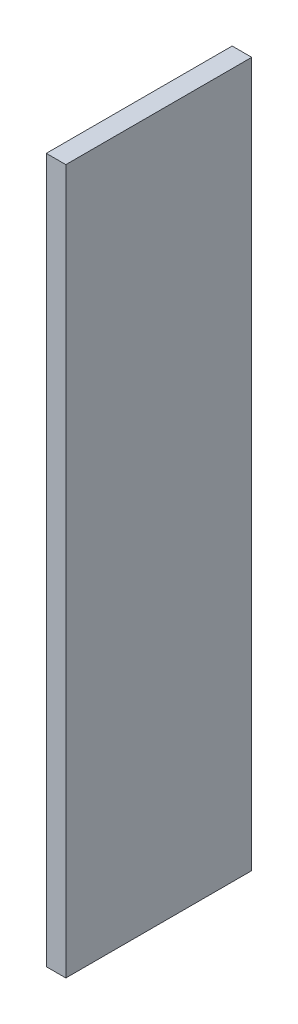
ISO-10303-21;
HEADER;
FILE_DESCRIPTION(('STEP AP214'),'2;1');
FILE_NAME('part.step','',(''),(''),'','','');
FILE_SCHEMA(('AUTOMOTIVE_DESIGN { 1 0 10303 214 1 1 1 1 }'));
ENDSEC;
DATA;
#1=APPLICATION_CONTEXT('core data for automotive mechanical design processes');
#2=APPLICATION_PROTOCOL_DEFINITION('international standard','automotive_design',2000,#1);
#3=PRODUCT_CONTEXT('',#1,'mechanical');
#4=PRODUCT('Part','Part','',(#3));
#5=PRODUCT_RELATED_PRODUCT_CATEGORY('part','',(#4));
#6=PRODUCT_DEFINITION_FORMATION('','',#4);
#7=PRODUCT_DEFINITION_CONTEXT('part definition',#1,'design');
#8=PRODUCT_DEFINITION('design','',#6,#7);
#9=PRODUCT_DEFINITION_SHAPE('','',#8);
#10=(LENGTH_UNIT() NAMED_UNIT(*) SI_UNIT(.MILLI.,.METRE.));
#11=(NAMED_UNIT(*) PLANE_ANGLE_UNIT() SI_UNIT($,.RADIAN.));
#12=(NAMED_UNIT(*) SI_UNIT($,.STERADIAN.) SOLID_ANGLE_UNIT());
#13=UNCERTAINTY_MEASURE_WITH_UNIT(LENGTH_MEASURE(1.E-05),#10,'distance_accuracy_value','');
#14=(GEOMETRIC_REPRESENTATION_CONTEXT(3) GLOBAL_UNCERTAINTY_ASSIGNED_CONTEXT((#13)) GLOBAL_UNIT_ASSIGNED_CONTEXT((#10,
#11,#12)) REPRESENTATION_CONTEXT('',''));
#15=CARTESIAN_POINT('',(0.,0.,0.));
#16=DIRECTION('',(0.,0.,1.));
#17=DIRECTION('',(1.,0.,0.));
#18=AXIS2_PLACEMENT_3D('',#15,#16,#17);
#19=CARTESIAN_POINT('',(-304.8,482.6,50.8));
#20=DIRECTION('',(1.,0.,0.));
#21=DIRECTION('',(0.,1.,0.));
#22=AXIS2_PLACEMENT_3D('',#19,#20,#21);
#23=PLANE('',#22);
#24=DIRECTION('',(0.,0.,1.));
#25=VECTOR('',#24,1.);
#26=CARTESIAN_POINT('',(-304.8,25.4,50.8));
#27=LINE('',#26,#25);
#28=CARTESIAN_POINT('',(-304.8,25.4,-69.8500000000001));
#29=VERTEX_POINT('',#28);
#30=CARTESIAN_POINT('',(-304.8,25.4,50.8));
#31=VERTEX_POINT('',#30);
#32=EDGE_CURVE('E96',#29,#31,#27,.T.);
#33=ORIENTED_EDGE('',*,*,#32,.T.);
#34=DIRECTION('',(0.,-1.,0.));
#35=VECTOR('',#34,1.);
#36=CARTESIAN_POINT('',(-304.8,482.6,50.8));
#37=LINE('',#36,#35);
#38=CARTESIAN_POINT('',(-304.8,482.6,50.8));
#39=VERTEX_POINT('',#38);
#40=EDGE_CURVE('E11',#39,#31,#37,.T.);
#41=ORIENTED_EDGE('',*,*,#40,.F.);
#42=DIRECTION('',(0.,0.,1.));
#43=VECTOR('',#42,1.);
#44=CARTESIAN_POINT('',(-304.8,482.6,50.8));
#45=LINE('',#44,#43);
#46=CARTESIAN_POINT('',(-304.8,482.6,-69.8500000000001));
#47=VERTEX_POINT('',#46);
#48=EDGE_CURVE('E84',#47,#39,#45,.T.);
#49=ORIENTED_EDGE('',*,*,#48,.F.);
#50=DIRECTION('',(0.,-1.,0.));
#51=VECTOR('',#50,1.);
#52=CARTESIAN_POINT('',(-304.8,482.6,-69.8500000000001));
#53=LINE('',#52,#51);
#54=EDGE_CURVE('E92',#47,#29,#53,.T.);
#55=ORIENTED_EDGE('',*,*,#54,.T.);
#56=EDGE_LOOP('',(#33,#41,#49,#55));
#57=FACE_BOUND('',#56,.T.);
#58=ADVANCED_FACE('F33',(#57),#23,.F.);
#59=CARTESIAN_POINT('',(-304.8,482.6,50.8));
#60=DIRECTION('',(0.,0.,-1.));
#61=DIRECTION('',(0.,1.,0.));
#62=AXIS2_PLACEMENT_3D('',#59,#60,#61);
#63=PLANE('',#62);
#64=DIRECTION('',(1.,0.,0.));
#65=VECTOR('',#64,1.);
#66=CARTESIAN_POINT('',(-304.8,25.4,50.8));
#67=LINE('',#66,#65);
#68=CARTESIAN_POINT('',(-292.1,25.4,50.8));
#69=VERTEX_POINT('',#68);
#70=EDGE_CURVE('E88',#31,#69,#67,.T.);
#71=ORIENTED_EDGE('',*,*,#70,.T.);
#72=DIRECTION('',(0.,-1.,0.));
#73=VECTOR('',#72,1.);
#74=CARTESIAN_POINT('',(-292.1,482.6,50.8));
#75=LINE('',#74,#73);
#76=CARTESIAN_POINT('',(-292.1,482.6,50.8));
#77=VERTEX_POINT('',#76);
#78=EDGE_CURVE('E41',#77,#69,#75,.T.);
#79=ORIENTED_EDGE('',*,*,#78,.F.);
#80=DIRECTION('',(1.,0.,0.));
#81=VECTOR('',#80,1.);
#82=CARTESIAN_POINT('',(-304.8,482.6,50.8));
#83=LINE('',#82,#81);
#84=EDGE_CURVE('E79',#39,#77,#83,.T.);
#85=ORIENTED_EDGE('',*,*,#84,.F.);
#86=ORIENTED_EDGE('',*,*,#40,.T.);
#87=EDGE_LOOP('',(#71,#79,#85,#86));
#88=FACE_BOUND('',#87,.T.);
#89=ADVANCED_FACE('F87',(#88),#63,.F.);
#90=CARTESIAN_POINT('',(-292.1,482.6,50.8));
#91=DIRECTION('',(-1.,0.,0.));
#92=DIRECTION('',(0.,0.,1.));
#93=AXIS2_PLACEMENT_3D('',#90,#91,#92);
#94=PLANE('',#93);
#95=DIRECTION('',(0.,0.,-1.));
#96=VECTOR('',#95,1.);
#97=CARTESIAN_POINT('',(-292.1,25.4,50.8));
#98=LINE('',#97,#96);
#99=CARTESIAN_POINT('',(-292.1,25.4,-69.8500000000001));
#100=VERTEX_POINT('',#99);
#101=EDGE_CURVE('E66',#69,#100,#98,.T.);
#102=ORIENTED_EDGE('',*,*,#101,.T.);
#103=DIRECTION('',(0.,-1.,0.));
#104=VECTOR('',#103,1.);
#105=CARTESIAN_POINT('',(-292.1,482.6,-69.8500000000001));
#106=LINE('',#105,#104);
#107=CARTESIAN_POINT('',(-292.1,482.6,-69.8500000000001));
#108=VERTEX_POINT('',#107);
#109=EDGE_CURVE('E89',#108,#100,#106,.T.);
#110=ORIENTED_EDGE('',*,*,#109,.F.);
#111=DIRECTION('',(0.,0.,-1.));
#112=VECTOR('',#111,1.);
#113=CARTESIAN_POINT('',(-292.1,482.6,50.8));
#114=LINE('',#113,#112);
#115=EDGE_CURVE('E82',#77,#108,#114,.T.);
#116=ORIENTED_EDGE('',*,*,#115,.F.);
#117=ORIENTED_EDGE('',*,*,#78,.T.);
#118=EDGE_LOOP('',(#102,#110,#116,#117));
#119=FACE_BOUND('',#118,.T.);
#120=ADVANCED_FACE('F90',(#119),#94,.F.);
#121=CARTESIAN_POINT('',(-304.8,482.6,-69.8500000000001));
#122=DIRECTION('',(0.,0.,1.));
#123=DIRECTION('',(0.,-1.,0.));
#124=AXIS2_PLACEMENT_3D('',#121,#122,#123);
#125=PLANE('',#124);
#126=DIRECTION('',(-1.,0.,0.));
#127=VECTOR('',#126,1.);
#128=CARTESIAN_POINT('',(-304.8,25.4,-69.8500000000001));
#129=LINE('',#128,#127);
#130=EDGE_CURVE('E72',#100,#29,#129,.T.);
#131=ORIENTED_EDGE('',*,*,#130,.T.);
#132=ORIENTED_EDGE('',*,*,#54,.F.);
#133=DIRECTION('',(-1.,0.,0.));
#134=VECTOR('',#133,1.);
#135=CARTESIAN_POINT('',(-304.8,482.6,-69.8500000000001));
#136=LINE('',#135,#134);
#137=EDGE_CURVE('E49',#108,#47,#136,.T.);
#138=ORIENTED_EDGE('',*,*,#137,.F.);
#139=ORIENTED_EDGE('',*,*,#109,.T.);
#140=EDGE_LOOP('',(#131,#132,#138,#139));
#141=FACE_BOUND('',#140,.T.);
#142=ADVANCED_FACE('F103',(#141),#125,.F.);
#143=CARTESIAN_POINT('',(0.,482.6,0.));
#144=DIRECTION('',(0.,-1.,0.));
#145=DIRECTION('',(0.,0.,-1.));
#146=AXIS2_PLACEMENT_3D('',#143,#144,#145);
#147=PLANE('',#146);
#148=ORIENTED_EDGE('',*,*,#48,.T.);
#149=ORIENTED_EDGE('',*,*,#84,.T.);
#150=ORIENTED_EDGE('',*,*,#115,.T.);
#151=ORIENTED_EDGE('',*,*,#137,.T.);
#152=EDGE_LOOP('',(#148,#149,#150,#151));
#153=FACE_BOUND('',#152,.T.);
#154=ADVANCED_FACE('F80',(#153),#147,.F.);
#155=CARTESIAN_POINT('',(0.,25.4,0.));
#156=DIRECTION('',(0.,-1.,0.));
#157=DIRECTION('',(0.,0.,-1.));
#158=AXIS2_PLACEMENT_3D('',#155,#156,#157);
#159=PLANE('',#158);
#160=ORIENTED_EDGE('',*,*,#32,.F.);
#161=ORIENTED_EDGE('',*,*,#130,.F.);
#162=ORIENTED_EDGE('',*,*,#101,.F.);
#163=ORIENTED_EDGE('',*,*,#70,.F.);
#164=EDGE_LOOP('',(#160,#161,#162,#163));
#165=FACE_BOUND('',#164,.T.);
#166=ADVANCED_FACE('F106',(#165),#159,.T.);
#167=CLOSED_SHELL('',(#58,#89,#120,#142,#154,#166));
#168=MANIFOLD_SOLID_BREP('B2',#167);
#169=ADVANCED_BREP_SHAPE_REPRESENTATION('',(#18,#168),#14);
#170=SHAPE_DEFINITION_REPRESENTATION(#9,#169);
ENDSEC;
END-ISO-10303-21;
